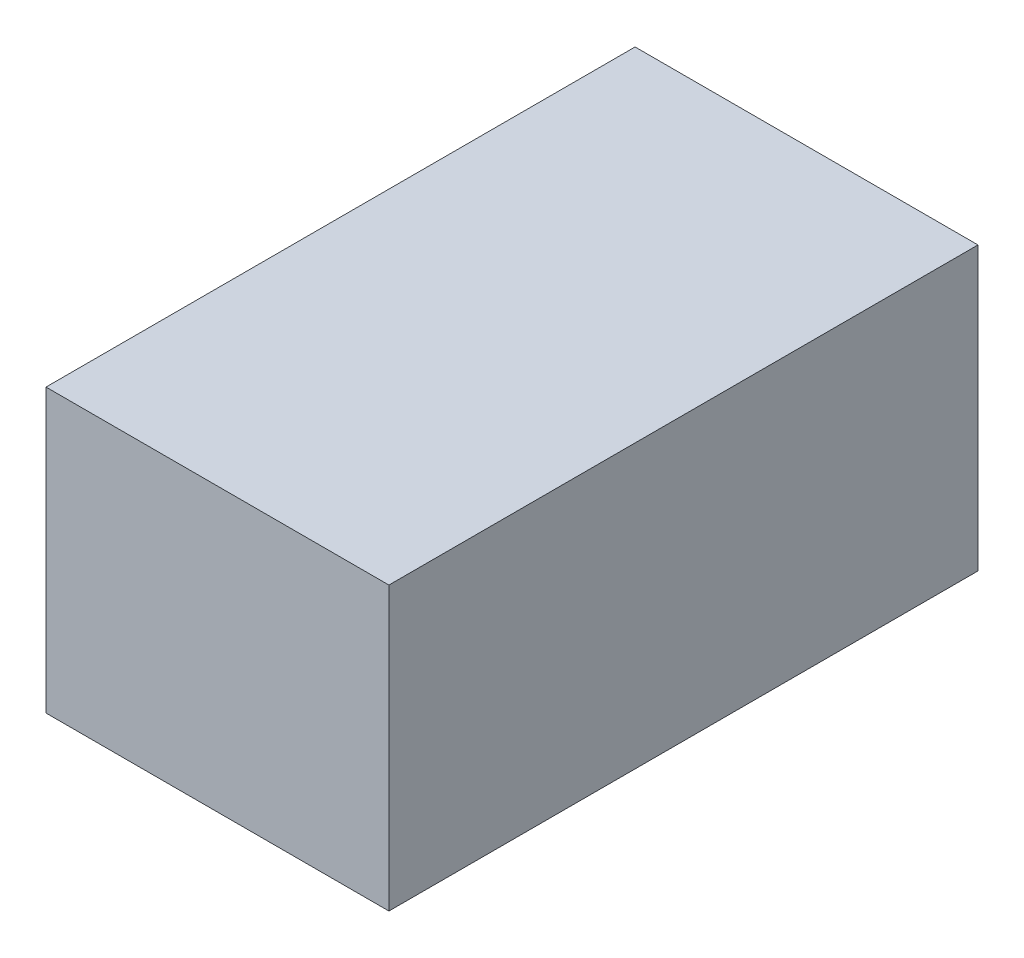
ISO-10303-21;
HEADER;
FILE_DESCRIPTION(('STEP AP214'),'2;1');
FILE_NAME('part.step','',(''),(''),'','','');
FILE_SCHEMA(('AUTOMOTIVE_DESIGN { 1 0 10303 214 1 1 1 1 }'));
ENDSEC;
DATA;
#1=APPLICATION_CONTEXT('core data for automotive mechanical design processes');
#2=APPLICATION_PROTOCOL_DEFINITION('international standard','automotive_design',2000,#1);
#3=PRODUCT_CONTEXT('',#1,'mechanical');
#4=PRODUCT('Part','Part','',(#3));
#5=PRODUCT_RELATED_PRODUCT_CATEGORY('part','',(#4));
#6=PRODUCT_DEFINITION_FORMATION('','',#4);
#7=PRODUCT_DEFINITION_CONTEXT('part definition',#1,'design');
#8=PRODUCT_DEFINITION('design','',#6,#7);
#9=PRODUCT_DEFINITION_SHAPE('','',#8);
#10=(LENGTH_UNIT() NAMED_UNIT(*) SI_UNIT(.MILLI.,.METRE.));
#11=(NAMED_UNIT(*) PLANE_ANGLE_UNIT() SI_UNIT($,.RADIAN.));
#12=(NAMED_UNIT(*) SI_UNIT($,.STERADIAN.) SOLID_ANGLE_UNIT());
#13=UNCERTAINTY_MEASURE_WITH_UNIT(LENGTH_MEASURE(1.E-05),#10,'distance_accuracy_value','');
#14=(GEOMETRIC_REPRESENTATION_CONTEXT(3) GLOBAL_UNCERTAINTY_ASSIGNED_CONTEXT((#13)) GLOBAL_UNIT_ASSIGNED_CONTEXT((#10,
#11,#12)) REPRESENTATION_CONTEXT('',''));
#15=CARTESIAN_POINT('',(0.,0.,0.));
#16=DIRECTION('',(0.,0.,1.));
#17=DIRECTION('',(1.,0.,0.));
#18=AXIS2_PLACEMENT_3D('',#15,#16,#17);
#19=CARTESIAN_POINT('',(0.,115.65,0.));
#20=DIRECTION('',(1.,0.,0.));
#21=DIRECTION('',(0.,0.,-1.));
#22=AXIS2_PLACEMENT_3D('',#19,#20,#21);
#23=PLANE('',#22);
#24=DIRECTION('',(0.,0.,1.));
#25=VECTOR('',#24,1.);
#26=CARTESIAN_POINT('',(0.,0.,0.));
#27=LINE('',#26,#25);
#28=CARTESIAN_POINT('',(0.,0.,0.));
#29=VERTEX_POINT('',#28);
#30=CARTESIAN_POINT('',(0.,0.,241.3));
#31=VERTEX_POINT('',#30);
#32=EDGE_CURVE('E120',#29,#31,#27,.T.);
#33=ORIENTED_EDGE('',*,*,#32,.T.);
#34=DIRECTION('',(0.,-1.,0.));
#35=VECTOR('',#34,1.);
#36=CARTESIAN_POINT('',(0.,115.65,241.3));
#37=LINE('',#36,#35);
#38=CARTESIAN_POINT('',(0.,115.65,241.3));
#39=VERTEX_POINT('',#38);
#40=EDGE_CURVE('E11',#39,#31,#37,.T.);
#41=ORIENTED_EDGE('',*,*,#40,.F.);
#42=DIRECTION('',(0.,0.,1.));
#43=VECTOR('',#42,1.);
#44=CARTESIAN_POINT('',(0.,115.65,0.));
#45=LINE('',#44,#43);
#46=CARTESIAN_POINT('',(0.,115.65,0.));
#47=VERTEX_POINT('',#46);
#48=EDGE_CURVE('E102',#47,#39,#45,.T.);
#49=ORIENTED_EDGE('',*,*,#48,.F.);
#50=DIRECTION('',(0.,-1.,0.));
#51=VECTOR('',#50,1.);
#52=CARTESIAN_POINT('',(0.,115.65,0.));
#53=LINE('',#52,#51);
#54=EDGE_CURVE('E116',#47,#29,#53,.T.);
#55=ORIENTED_EDGE('',*,*,#54,.T.);
#56=EDGE_LOOP('',(#33,#41,#49,#55));
#57=FACE_BOUND('',#56,.T.);
#58=ADVANCED_FACE('F47',(#57),#23,.F.);
#59=CARTESIAN_POINT('',(0.,115.65,241.3));
#60=DIRECTION('',(0.,0.,-1.));
#61=DIRECTION('',(-1.,0.,0.));
#62=AXIS2_PLACEMENT_3D('',#59,#60,#61);
#63=PLANE('',#62);
#64=DIRECTION('',(1.,0.,0.));
#65=VECTOR('',#64,1.);
#66=CARTESIAN_POINT('',(0.,0.,241.3));
#67=LINE('',#66,#65);
#68=CARTESIAN_POINT('',(140.462,0.,241.3));
#69=VERTEX_POINT('',#68);
#70=EDGE_CURVE('E107',#31,#69,#67,.T.);
#71=ORIENTED_EDGE('',*,*,#70,.T.);
#72=DIRECTION('',(0.,-1.,0.));
#73=VECTOR('',#72,1.);
#74=CARTESIAN_POINT('',(140.462,115.65,241.3));
#75=LINE('',#74,#73);
#76=CARTESIAN_POINT('',(140.462,115.65,241.3));
#77=VERTEX_POINT('',#76);
#78=EDGE_CURVE('E56',#77,#69,#75,.T.);
#79=ORIENTED_EDGE('',*,*,#78,.F.);
#80=DIRECTION('',(1.,0.,0.));
#81=VECTOR('',#80,1.);
#82=CARTESIAN_POINT('',(0.,115.65,241.3));
#83=LINE('',#82,#81);
#84=EDGE_CURVE('E97',#39,#77,#83,.T.);
#85=ORIENTED_EDGE('',*,*,#84,.F.);
#86=ORIENTED_EDGE('',*,*,#40,.T.);
#87=EDGE_LOOP('',(#71,#79,#85,#86));
#88=FACE_BOUND('',#87,.T.);
#89=ADVANCED_FACE('F106',(#88),#63,.F.);
#90=CARTESIAN_POINT('',(140.462,115.65,0.));
#91=DIRECTION('',(-1.,0.,0.));
#92=DIRECTION('',(0.,0.,1.));
#93=AXIS2_PLACEMENT_3D('',#90,#91,#92);
#94=PLANE('',#93);
#95=DIRECTION('',(0.,0.,-1.));
#96=VECTOR('',#95,1.);
#97=CARTESIAN_POINT('',(140.462,0.,0.));
#98=LINE('',#97,#96);
#99=CARTESIAN_POINT('',(140.462,0.,0.));
#100=VERTEX_POINT('',#99);
#101=EDGE_CURVE('E84',#69,#100,#98,.T.);
#102=ORIENTED_EDGE('',*,*,#101,.T.);
#103=DIRECTION('',(0.,-1.,0.));
#104=VECTOR('',#103,1.);
#105=CARTESIAN_POINT('',(140.462,115.65,0.));
#106=LINE('',#105,#104);
#107=CARTESIAN_POINT('',(140.462,115.65,0.));
#108=VERTEX_POINT('',#107);
#109=EDGE_CURVE('E109',#108,#100,#106,.T.);
#110=ORIENTED_EDGE('',*,*,#109,.F.);
#111=DIRECTION('',(0.,0.,-1.));
#112=VECTOR('',#111,1.);
#113=CARTESIAN_POINT('',(140.462,115.65,0.));
#114=LINE('',#113,#112);
#115=EDGE_CURVE('E100',#77,#108,#114,.T.);
#116=ORIENTED_EDGE('',*,*,#115,.F.);
#117=ORIENTED_EDGE('',*,*,#78,.T.);
#118=EDGE_LOOP('',(#102,#110,#116,#117));
#119=FACE_BOUND('',#118,.T.);
#120=ADVANCED_FACE('F110',(#119),#94,.F.);
#121=CARTESIAN_POINT('',(0.,115.65,0.));
#122=DIRECTION('',(0.,0.,1.));
#123=DIRECTION('',(1.,0.,0.));
#124=AXIS2_PLACEMENT_3D('',#121,#122,#123);
#125=PLANE('',#124);
#126=DIRECTION('',(-1.,0.,0.));
#127=VECTOR('',#126,1.);
#128=CARTESIAN_POINT('',(0.,0.,0.));
#129=LINE('',#128,#127);
#130=EDGE_CURVE('E90',#100,#29,#129,.T.);
#131=ORIENTED_EDGE('',*,*,#130,.T.);
#132=ORIENTED_EDGE('',*,*,#54,.F.);
#133=DIRECTION('',(-1.,0.,0.));
#134=VECTOR('',#133,1.);
#135=CARTESIAN_POINT('',(0.,115.65,0.));
#136=LINE('',#135,#134);
#137=EDGE_CURVE('E64',#108,#47,#136,.T.);
#138=ORIENTED_EDGE('',*,*,#137,.F.);
#139=ORIENTED_EDGE('',*,*,#109,.T.);
#140=EDGE_LOOP('',(#131,#132,#138,#139));
#141=FACE_BOUND('',#140,.T.);
#142=ADVANCED_FACE('F131',(#141),#125,.F.);
#143=CARTESIAN_POINT('',(0.,115.65,0.));
#144=DIRECTION('',(0.,1.,0.));
#145=DIRECTION('',(0.,0.,1.));
#146=AXIS2_PLACEMENT_3D('',#143,#144,#145);
#147=PLANE('',#146);
#148=ORIENTED_EDGE('',*,*,#48,.T.);
#149=ORIENTED_EDGE('',*,*,#84,.T.);
#150=ORIENTED_EDGE('',*,*,#115,.T.);
#151=ORIENTED_EDGE('',*,*,#137,.T.);
#152=EDGE_LOOP('',(#148,#149,#150,#151));
#153=FACE_BOUND('',#152,.T.);
#154=ADVANCED_FACE('F98',(#153),#147,.T.);
#155=CARTESIAN_POINT('',(0.,0.,0.));
#156=DIRECTION('',(0.,1.,0.));
#157=DIRECTION('',(0.,0.,1.));
#158=AXIS2_PLACEMENT_3D('',#155,#156,#157);
#159=PLANE('',#158);
#160=ORIENTED_EDGE('',*,*,#32,.F.);
#161=ORIENTED_EDGE('',*,*,#130,.F.);
#162=ORIENTED_EDGE('',*,*,#101,.F.);
#163=ORIENTED_EDGE('',*,*,#70,.F.);
#164=EDGE_LOOP('',(#160,#161,#162,#163));
#165=FACE_BOUND('',#164,.T.);
#166=ADVANCED_FACE('F134',(#165),#159,.F.);
#167=CLOSED_SHELL('',(#58,#89,#120,#142,#154,#166));
#168=MANIFOLD_SOLID_BREP('B2',#167);
#169=ADVANCED_BREP_SHAPE_REPRESENTATION('',(#18,#168),#14);
#170=SHAPE_DEFINITION_REPRESENTATION(#9,#169);
ENDSEC;
END-ISO-10303-21;
